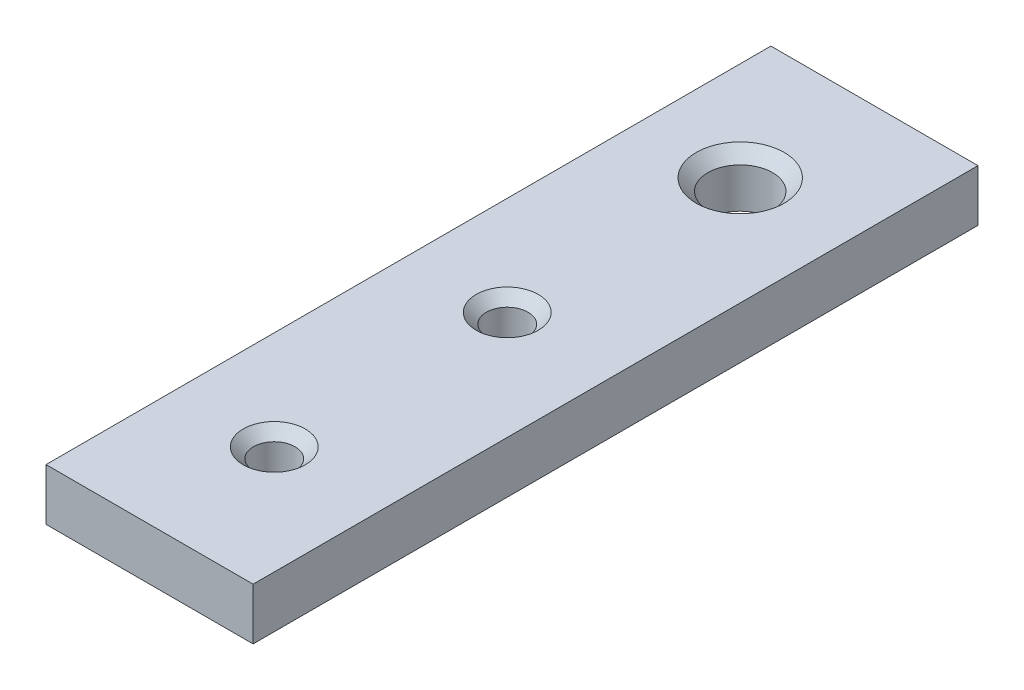
ISO-10303-21;
HEADER;
FILE_DESCRIPTION(('STEP AP214'),'2;1');
FILE_NAME('part.step','',(''),(''),'','','');
FILE_SCHEMA(('AUTOMOTIVE_DESIGN { 1 0 10303 214 1 1 1 1 }'));
ENDSEC;
DATA;
#1=APPLICATION_CONTEXT('core data for automotive mechanical design processes');
#2=APPLICATION_PROTOCOL_DEFINITION('international standard','automotive_design',2000,#1);
#3=PRODUCT_CONTEXT('',#1,'mechanical');
#4=PRODUCT('Part','Part','',(#3));
#5=PRODUCT_RELATED_PRODUCT_CATEGORY('part','',(#4));
#6=PRODUCT_DEFINITION_FORMATION('','',#4);
#7=PRODUCT_DEFINITION_CONTEXT('part definition',#1,'design');
#8=PRODUCT_DEFINITION('design','',#6,#7);
#9=PRODUCT_DEFINITION_SHAPE('','',#8);
#10=(LENGTH_UNIT() NAMED_UNIT(*) SI_UNIT(.MILLI.,.METRE.));
#11=(NAMED_UNIT(*) PLANE_ANGLE_UNIT() SI_UNIT($,.RADIAN.));
#12=(NAMED_UNIT(*) SI_UNIT($,.STERADIAN.) SOLID_ANGLE_UNIT());
#13=UNCERTAINTY_MEASURE_WITH_UNIT(LENGTH_MEASURE(1.E-05),#10,'distance_accuracy_value','');
#14=(GEOMETRIC_REPRESENTATION_CONTEXT(3) GLOBAL_UNCERTAINTY_ASSIGNED_CONTEXT((#13)) GLOBAL_UNIT_ASSIGNED_CONTEXT((#10,
#11,#12)) REPRESENTATION_CONTEXT('',''));
#15=CARTESIAN_POINT('',(0.,0.,0.));
#16=DIRECTION('',(0.,0.,1.));
#17=DIRECTION('',(1.,0.,0.));
#18=AXIS2_PLACEMENT_3D('',#15,#16,#17);
#19=CARTESIAN_POINT('',(0.,6.35,0.));
#20=DIRECTION('',(-1.,0.,0.));
#21=DIRECTION('',(0.,0.,1.));
#22=AXIS2_PLACEMENT_3D('',#19,#20,#21);
#23=PLANE('',#22);
#24=DIRECTION('',(0.,0.,-1.));
#25=VECTOR('',#24,1.);
#26=CARTESIAN_POINT('',(0.,0.,0.));
#27=LINE('',#26,#25);
#28=CARTESIAN_POINT('',(0.,0.,0.));
#29=VERTEX_POINT('',#28);
#30=CARTESIAN_POINT('',(0.,0.,-88.9));
#31=VERTEX_POINT('',#30);
#32=EDGE_CURVE('E100',#29,#31,#27,.T.);
#33=ORIENTED_EDGE('',*,*,#32,.T.);
#34=DIRECTION('',(0.,-1.,0.));
#35=VECTOR('',#34,1.);
#36=CARTESIAN_POINT('',(0.,6.35,-88.9));
#37=LINE('',#36,#35);
#38=CARTESIAN_POINT('',(0.,6.35,-88.9));
#39=VERTEX_POINT('',#38);
#40=EDGE_CURVE('E11',#39,#31,#37,.T.);
#41=ORIENTED_EDGE('',*,*,#40,.F.);
#42=DIRECTION('',(0.,0.,-1.));
#43=VECTOR('',#42,1.);
#44=CARTESIAN_POINT('',(0.,6.35,0.));
#45=LINE('',#44,#43);
#46=CARTESIAN_POINT('',(0.,6.35,0.));
#47=VERTEX_POINT('',#46);
#48=EDGE_CURVE('E88',#47,#39,#45,.T.);
#49=ORIENTED_EDGE('',*,*,#48,.F.);
#50=DIRECTION('',(0.,-1.,0.));
#51=VECTOR('',#50,1.);
#52=CARTESIAN_POINT('',(0.,6.35,0.));
#53=LINE('',#52,#51);
#54=EDGE_CURVE('E96',#47,#29,#53,.T.);
#55=ORIENTED_EDGE('',*,*,#54,.T.);
#56=EDGE_LOOP('',(#33,#41,#49,#55));
#57=FACE_BOUND('',#56,.T.);
#58=ADVANCED_FACE('F37',(#57),#23,.F.);
#59=CARTESIAN_POINT('',(0.,6.35,-88.9));
#60=DIRECTION('',(0.,0.,1.));
#61=DIRECTION('',(1.,0.,0.));
#62=AXIS2_PLACEMENT_3D('',#59,#60,#61);
#63=PLANE('',#62);
#64=DIRECTION('',(-1.,0.,0.));
#65=VECTOR('',#64,1.);
#66=CARTESIAN_POINT('',(0.,0.,-88.9));
#67=LINE('',#66,#65);
#68=CARTESIAN_POINT('',(-25.4,0.,-88.9));
#69=VERTEX_POINT('',#68);
#70=EDGE_CURVE('E92',#31,#69,#67,.T.);
#71=ORIENTED_EDGE('',*,*,#70,.T.);
#72=DIRECTION('',(0.,-1.,0.));
#73=VECTOR('',#72,1.);
#74=CARTESIAN_POINT('',(-25.4,6.35,-88.9));
#75=LINE('',#74,#73);
#76=CARTESIAN_POINT('',(-25.4,6.35,-88.9));
#77=VERTEX_POINT('',#76);
#78=EDGE_CURVE('E45',#77,#69,#75,.T.);
#79=ORIENTED_EDGE('',*,*,#78,.F.);
#80=DIRECTION('',(-1.,0.,0.));
#81=VECTOR('',#80,1.);
#82=CARTESIAN_POINT('',(0.,6.35,-88.9));
#83=LINE('',#82,#81);
#84=EDGE_CURVE('E83',#39,#77,#83,.T.);
#85=ORIENTED_EDGE('',*,*,#84,.F.);
#86=ORIENTED_EDGE('',*,*,#40,.T.);
#87=EDGE_LOOP('',(#71,#79,#85,#86));
#88=FACE_BOUND('',#87,.T.);
#89=ADVANCED_FACE('F91',(#88),#63,.F.);
#90=CARTESIAN_POINT('',(-25.4,6.35,0.));
#91=DIRECTION('',(1.,0.,0.));
#92=DIRECTION('',(0.,0.,-1.));
#93=AXIS2_PLACEMENT_3D('',#90,#91,#92);
#94=PLANE('',#93);
#95=DIRECTION('',(0.,0.,1.));
#96=VECTOR('',#95,1.);
#97=CARTESIAN_POINT('',(-25.4,0.,0.));
#98=LINE('',#97,#96);
#99=CARTESIAN_POINT('',(-25.4,0.,0.));
#100=VERTEX_POINT('',#99);
#101=EDGE_CURVE('E70',#69,#100,#98,.T.);
#102=ORIENTED_EDGE('',*,*,#101,.T.);
#103=DIRECTION('',(0.,-1.,0.));
#104=VECTOR('',#103,1.);
#105=CARTESIAN_POINT('',(-25.4,6.35,0.));
#106=LINE('',#105,#104);
#107=CARTESIAN_POINT('',(-25.4,6.35,0.));
#108=VERTEX_POINT('',#107);
#109=EDGE_CURVE('E93',#108,#100,#106,.T.);
#110=ORIENTED_EDGE('',*,*,#109,.F.);
#111=DIRECTION('',(0.,0.,1.));
#112=VECTOR('',#111,1.);
#113=CARTESIAN_POINT('',(-25.4,6.35,0.));
#114=LINE('',#113,#112);
#115=EDGE_CURVE('E86',#77,#108,#114,.T.);
#116=ORIENTED_EDGE('',*,*,#115,.F.);
#117=ORIENTED_EDGE('',*,*,#78,.T.);
#118=EDGE_LOOP('',(#102,#110,#116,#117));
#119=FACE_BOUND('',#118,.T.);
#120=ADVANCED_FACE('F94',(#119),#94,.F.);
#121=CARTESIAN_POINT('',(0.,6.35,0.));
#122=DIRECTION('',(0.,0.,-1.));
#123=DIRECTION('',(-1.,0.,0.));
#124=AXIS2_PLACEMENT_3D('',#121,#122,#123);
#125=PLANE('',#124);
#126=DIRECTION('',(1.,0.,0.));
#127=VECTOR('',#126,1.);
#128=CARTESIAN_POINT('',(0.,0.,0.));
#129=LINE('',#128,#127);
#130=EDGE_CURVE('E76',#100,#29,#129,.T.);
#131=ORIENTED_EDGE('',*,*,#130,.T.);
#132=ORIENTED_EDGE('',*,*,#54,.F.);
#133=DIRECTION('',(1.,0.,0.));
#134=VECTOR('',#133,1.);
#135=CARTESIAN_POINT('',(0.,6.35,0.));
#136=LINE('',#135,#134);
#137=EDGE_CURVE('E53',#108,#47,#136,.T.);
#138=ORIENTED_EDGE('',*,*,#137,.F.);
#139=ORIENTED_EDGE('',*,*,#109,.T.);
#140=EDGE_LOOP('',(#131,#132,#138,#139));
#141=FACE_BOUND('',#140,.T.);
#142=ADVANCED_FACE('F108',(#141),#125,.F.);
#143=CARTESIAN_POINT('',(0.,6.35,0.));
#144=DIRECTION('',(0.,1.,0.));
#145=DIRECTION('',(0.,0.,1.));
#146=AXIS2_PLACEMENT_3D('',#143,#144,#145);
#147=PLANE('',#146);
#148=CARTESIAN_POINT('',(-13.2844190722783,6.35,-73.025));
#149=DIRECTION('',(0.,1.,0.));
#150=DIRECTION('',(0.,0.,1.));
#151=AXIS2_PLACEMENT_3D('',#148,#149,#150);
#152=CIRCLE('',#151,5.3975);
#153=CARTESIAN_POINT('',(-13.2844190722783,6.35,-67.6275));
#154=VERTEX_POINT('',#153);
#155=EDGE_CURVE('E137',#154,#154,#152,.T.);
#156=ORIENTED_EDGE('',*,*,#155,.F.);
#157=EDGE_LOOP('',(#156));
#158=FACE_BOUND('',#157,.T.);
#159=CARTESIAN_POINT('',(-13.2844190722783,6.35,-15.875));
#160=DIRECTION('',(0.,1.,0.));
#161=DIRECTION('',(0.,0.,1.));
#162=AXIS2_PLACEMENT_3D('',#159,#160,#161);
#163=CIRCLE('',#162,3.81);
#164=CARTESIAN_POINT('',(-13.2844190722783,6.35,-12.065));
#165=VERTEX_POINT('',#164);
#166=EDGE_CURVE('E128',#165,#165,#163,.T.);
#167=ORIENTED_EDGE('',*,*,#166,.F.);
#168=EDGE_LOOP('',(#167));
#169=FACE_BOUND('',#168,.T.);
#170=CARTESIAN_POINT('',(-13.2844190722783,6.35,-44.45));
#171=DIRECTION('',(0.,1.,0.));
#172=DIRECTION('',(0.,0.,1.));
#173=AXIS2_PLACEMENT_3D('',#170,#171,#172);
#174=CIRCLE('',#173,3.81);
#175=CARTESIAN_POINT('',(-13.2844190722783,6.35,-40.64));
#176=VERTEX_POINT('',#175);
#177=EDGE_CURVE('E119',#176,#176,#174,.T.);
#178=ORIENTED_EDGE('',*,*,#177,.F.);
#179=EDGE_LOOP('',(#178));
#180=FACE_BOUND('',#179,.T.);
#181=ORIENTED_EDGE('',*,*,#48,.T.);
#182=ORIENTED_EDGE('',*,*,#84,.T.);
#183=ORIENTED_EDGE('',*,*,#115,.T.);
#184=ORIENTED_EDGE('',*,*,#137,.T.);
#185=EDGE_LOOP('',(#181,#182,#183,#184));
#186=FACE_BOUND('',#185,.T.);
#187=ADVANCED_FACE('F84',(#158,#169,#180,#186),#147,.T.);
#188=CARTESIAN_POINT('',(0.,0.,0.));
#189=DIRECTION('',(0.,1.,0.));
#190=DIRECTION('',(0.,0.,1.));
#191=AXIS2_PLACEMENT_3D('',#188,#189,#190);
#192=PLANE('',#191);
#193=CARTESIAN_POINT('',(-13.2844190722783,0.,-73.025));
#194=DIRECTION('',(0.,1.,0.));
#195=DIRECTION('',(0.,0.,1.));
#196=AXIS2_PLACEMENT_3D('',#193,#194,#195);
#197=CIRCLE('',#196,3.96875);
#198=CARTESIAN_POINT('',(-13.2844190722783,0.,-69.05625));
#199=VERTEX_POINT('',#198);
#200=EDGE_CURVE('E131',#199,#199,#197,.T.);
#201=ORIENTED_EDGE('',*,*,#200,.T.);
#202=EDGE_LOOP('',(#201));
#203=FACE_BOUND('',#202,.T.);
#204=CARTESIAN_POINT('',(-13.2844190722783,0.,-15.875));
#205=DIRECTION('',(0.,1.,0.));
#206=DIRECTION('',(0.,0.,1.));
#207=AXIS2_PLACEMENT_3D('',#204,#205,#206);
#208=CIRCLE('',#207,2.5527);
#209=CARTESIAN_POINT('',(-13.2844190722783,0.,-13.3223));
#210=VERTEX_POINT('',#209);
#211=EDGE_CURVE('E122',#210,#210,#208,.T.);
#212=ORIENTED_EDGE('',*,*,#211,.T.);
#213=EDGE_LOOP('',(#212));
#214=FACE_BOUND('',#213,.T.);
#215=CARTESIAN_POINT('',(-13.2844190722783,0.,-44.45));
#216=DIRECTION('',(0.,1.,0.));
#217=DIRECTION('',(0.,0.,1.));
#218=AXIS2_PLACEMENT_3D('',#215,#216,#217);
#219=CIRCLE('',#218,2.5527);
#220=CARTESIAN_POINT('',(-13.2844190722783,0.,-41.8973));
#221=VERTEX_POINT('',#220);
#222=EDGE_CURVE('E103',#221,#221,#219,.T.);
#223=ORIENTED_EDGE('',*,*,#222,.T.);
#224=EDGE_LOOP('',(#223));
#225=FACE_BOUND('',#224,.T.);
#226=ORIENTED_EDGE('',*,*,#32,.F.);
#227=ORIENTED_EDGE('',*,*,#130,.F.);
#228=ORIENTED_EDGE('',*,*,#101,.F.);
#229=ORIENTED_EDGE('',*,*,#70,.F.);
#230=EDGE_LOOP('',(#226,#227,#228,#229));
#231=FACE_BOUND('',#230,.T.);
#232=ADVANCED_FACE('F111',(#203,#214,#225,#231),#192,.F.);
#233=CARTESIAN_POINT('',(-13.2844190722783,6.35,-44.45));
#234=DIRECTION('',(0.,1.,0.));
#235=DIRECTION('',(0.,0.,1.));
#236=AXIS2_PLACEMENT_3D('',#233,#234,#235);
#237=CYLINDRICAL_SURFACE('',#236,2.55269999999999);
#238=ORIENTED_EDGE('',*,*,#222,.F.);
#239=EDGE_LOOP('',(#238));
#240=FACE_BOUND('',#239,.T.);
#241=CARTESIAN_POINT('',(-13.2844190722783,5.0927,-44.45));
#242=DIRECTION('',(0.,1.,0.));
#243=DIRECTION('',(0.,0.,1.));
#244=AXIS2_PLACEMENT_3D('',#241,#242,#243);
#245=CIRCLE('',#244,2.55269999999999);
#246=CARTESIAN_POINT('',(-13.2844190722783,5.0927,-41.8973));
#247=VERTEX_POINT('',#246);
#248=EDGE_CURVE('E116',#247,#247,#245,.T.);
#249=ORIENTED_EDGE('',*,*,#248,.T.);
#250=EDGE_LOOP('',(#249));
#251=FACE_BOUND('',#250,.T.);
#252=ADVANCED_FACE('F153',(#240,#251),#237,.F.);
#253=CARTESIAN_POINT('',(-13.2844190722783,6.35,-44.45));
#254=DIRECTION('',(0.,1.,0.));
#255=DIRECTION('',(0.,0.,1.));
#256=AXIS2_PLACEMENT_3D('',#253,#254,#255);
#257=CONICAL_SURFACE('',#256,3.81,0.785398163397451);
#258=ORIENTED_EDGE('',*,*,#248,.F.);
#259=EDGE_LOOP('',(#258));
#260=FACE_BOUND('',#259,.T.);
#261=ORIENTED_EDGE('',*,*,#177,.T.);
#262=EDGE_LOOP('',(#261));
#263=FACE_BOUND('',#262,.T.);
#264=ADVANCED_FACE('F150',(#260,#263),#257,.F.);
#265=CARTESIAN_POINT('',(-13.2844190722783,6.35,-15.875));
#266=DIRECTION('',(0.,1.,0.));
#267=DIRECTION('',(0.,0.,1.));
#268=AXIS2_PLACEMENT_3D('',#265,#266,#267);
#269=CYLINDRICAL_SURFACE('',#268,2.55269999999999);
#270=ORIENTED_EDGE('',*,*,#211,.F.);
#271=EDGE_LOOP('',(#270));
#272=FACE_BOUND('',#271,.T.);
#273=CARTESIAN_POINT('',(-13.2844190722783,5.0927,-15.875));
#274=DIRECTION('',(0.,1.,0.));
#275=DIRECTION('',(0.,0.,1.));
#276=AXIS2_PLACEMENT_3D('',#273,#274,#275);
#277=CIRCLE('',#276,2.55269999999999);
#278=CARTESIAN_POINT('',(-13.2844190722783,5.0927,-13.3223));
#279=VERTEX_POINT('',#278);
#280=EDGE_CURVE('E125',#279,#279,#277,.T.);
#281=ORIENTED_EDGE('',*,*,#280,.T.);
#282=EDGE_LOOP('',(#281));
#283=FACE_BOUND('',#282,.T.);
#284=ADVANCED_FACE('F152',(#272,#283),#269,.F.);
#285=CARTESIAN_POINT('',(-13.2844190722783,6.35,-15.875));
#286=DIRECTION('',(0.,1.,0.));
#287=DIRECTION('',(0.,0.,1.));
#288=AXIS2_PLACEMENT_3D('',#285,#286,#287);
#289=CONICAL_SURFACE('',#288,3.81,0.785398163397451);
#290=ORIENTED_EDGE('',*,*,#280,.F.);
#291=EDGE_LOOP('',(#290));
#292=FACE_BOUND('',#291,.T.);
#293=ORIENTED_EDGE('',*,*,#166,.T.);
#294=EDGE_LOOP('',(#293));
#295=FACE_BOUND('',#294,.T.);
#296=ADVANCED_FACE('F160',(#292,#295),#289,.F.);
#297=CARTESIAN_POINT('',(-13.2844190722783,6.35,-73.025));
#298=DIRECTION('',(0.,1.,0.));
#299=DIRECTION('',(0.,0.,1.));
#300=AXIS2_PLACEMENT_3D('',#297,#298,#299);
#301=CYLINDRICAL_SURFACE('',#300,3.96875);
#302=ORIENTED_EDGE('',*,*,#200,.F.);
#303=EDGE_LOOP('',(#302));
#304=FACE_BOUND('',#303,.T.);
#305=CARTESIAN_POINT('',(-13.2844190722783,4.92125,-73.025));
#306=DIRECTION('',(0.,1.,0.));
#307=DIRECTION('',(0.,0.,1.));
#308=AXIS2_PLACEMENT_3D('',#305,#306,#307);
#309=CIRCLE('',#308,3.96875);
#310=CARTESIAN_POINT('',(-13.2844190722783,4.92125,-69.05625));
#311=VERTEX_POINT('',#310);
#312=EDGE_CURVE('E134',#311,#311,#309,.T.);
#313=ORIENTED_EDGE('',*,*,#312,.T.);
#314=EDGE_LOOP('',(#313));
#315=FACE_BOUND('',#314,.T.);
#316=ADVANCED_FACE('F192',(#304,#315),#301,.F.);
#317=CARTESIAN_POINT('',(-13.2844190722783,6.35,-73.025));
#318=DIRECTION('',(0.,1.,0.));
#319=DIRECTION('',(0.,0.,1.));
#320=AXIS2_PLACEMENT_3D('',#317,#318,#319);
#321=CONICAL_SURFACE('',#320,5.3975,0.78539816339745);
#322=ORIENTED_EDGE('',*,*,#312,.F.);
#323=EDGE_LOOP('',(#322));
#324=FACE_BOUND('',#323,.T.);
#325=ORIENTED_EDGE('',*,*,#155,.T.);
#326=EDGE_LOOP('',(#325));
#327=FACE_BOUND('',#326,.T.);
#328=ADVANCED_FACE('F141',(#324,#327),#321,.F.);
#329=CLOSED_SHELL('',(#58,#89,#120,#142,#187,#232,#252,#264,#284,#296,#316,#328));
#330=MANIFOLD_SOLID_BREP('B2',#329);
#331=ADVANCED_BREP_SHAPE_REPRESENTATION('',(#18,#330),#14);
#332=SHAPE_DEFINITION_REPRESENTATION(#9,#331);
ENDSEC;
END-ISO-10303-21;
